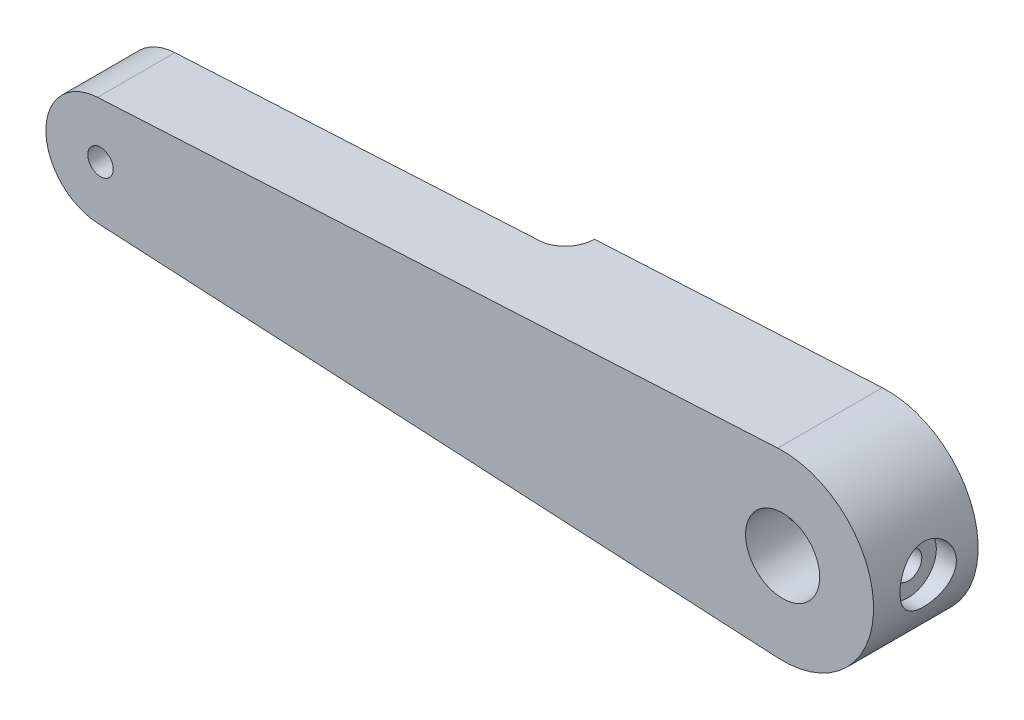
ISO-10303-21;
HEADER;
FILE_DESCRIPTION(('STEP AP214'),'2;1');
FILE_NAME('part.step','',(''),(''),'','','');
FILE_SCHEMA(('AUTOMOTIVE_DESIGN { 1 0 10303 214 1 1 1 1 }'));
ENDSEC;
DATA;
#1=APPLICATION_CONTEXT('core data for automotive mechanical design processes');
#2=APPLICATION_PROTOCOL_DEFINITION('international standard','automotive_design',2000,#1);
#3=PRODUCT_CONTEXT('',#1,'mechanical');
#4=PRODUCT('Part','Part','',(#3));
#5=PRODUCT_RELATED_PRODUCT_CATEGORY('part','',(#4));
#6=PRODUCT_DEFINITION_FORMATION('','',#4);
#7=PRODUCT_DEFINITION_CONTEXT('part definition',#1,'design');
#8=PRODUCT_DEFINITION('design','',#6,#7);
#9=PRODUCT_DEFINITION_SHAPE('','',#8);
#10=(LENGTH_UNIT() NAMED_UNIT(*) SI_UNIT(.MILLI.,.METRE.));
#11=(NAMED_UNIT(*) PLANE_ANGLE_UNIT() SI_UNIT($,.RADIAN.));
#12=(NAMED_UNIT(*) SI_UNIT($,.STERADIAN.) SOLID_ANGLE_UNIT());
#13=UNCERTAINTY_MEASURE_WITH_UNIT(LENGTH_MEASURE(1.E-05),#10,'distance_accuracy_value','');
#14=(GEOMETRIC_REPRESENTATION_CONTEXT(3) GLOBAL_UNCERTAINTY_ASSIGNED_CONTEXT((#13)) GLOBAL_UNIT_ASSIGNED_CONTEXT((#10,
#11,#12)) REPRESENTATION_CONTEXT('',''));
#15=CARTESIAN_POINT('',(0.,0.,0.));
#16=DIRECTION('',(0.,0.,1.));
#17=DIRECTION('',(1.,0.,0.));
#18=AXIS2_PLACEMENT_3D('',#15,#16,#17);
#19=CARTESIAN_POINT('',(-42.8022278368324,1.75605774082383E-09,-105.671884172269));
#20=DIRECTION('',(0.,0.,1.));
#21=DIRECTION('',(1.,0.,0.));
#22=AXIS2_PLACEMENT_3D('',#19,#20,#21);
#23=CYLINDRICAL_SURFACE('',#22,1.40000000752389);
#24=CARTESIAN_POINT('',(-42.8022278368324,1.75605774082383E-09,0.));
#25=DIRECTION('',(0.,0.,1.));
#26=DIRECTION('',(1.,0.,0.));
#27=AXIS2_PLACEMENT_3D('',#24,#25,#26);
#28=CIRCLE('',#27,1.40000000752389);
#29=CARTESIAN_POINT('',(-41.4022278293085,1.75605774082383E-09,0.));
#30=VERTEX_POINT('',#29);
#31=EDGE_CURVE('E123',#30,#30,#28,.T.);
#32=CARTESIAN_POINT('',(-42.8022278368324,1.75605774082383E-09,-6.00000000002038));
#33=DIRECTION('',(0.,0.,-1.));
#34=DIRECTION('',(-1.,0.,0.));
#35=AXIS2_PLACEMENT_3D('',#32,#33,#34);
#36=CIRCLE('',#35,1.40000000752389);
#37=CARTESIAN_POINT('',(-41.4022278293085,1.75605774082383E-09,-6.00000000002036));
#38=VERTEX_POINT('',#37);
#39=EDGE_CURVE('E44',#38,#38,#36,.F.);
#40=CARTESIAN_POINT('',(-41.4022278293085,1.75605774082383E-09,0.));
#41=CARTESIAN_POINT('',(-41.4022278293085,1.75605774082383E-09,-0.0625000000002245));
#42=CARTESIAN_POINT('',(-41.4022278293085,1.75605774082383E-09,-0.125000000000435));
#43=CARTESIAN_POINT('',(-41.4022278293085,1.75605774082383E-09,-0.250000000000861));
#44=CARTESIAN_POINT('',(-41.4022278293085,1.75605774082383E-09,-0.312500000001076));
#45=CARTESIAN_POINT('',(-41.4022278293085,1.75605774082383E-09,-0.437500000001502));
#46=CARTESIAN_POINT('',(-41.4022278293085,1.75605774082383E-09,-0.500000000001712));
#47=CARTESIAN_POINT('',(-41.4022278293085,1.75605774082383E-09,-0.625000000002133));
#48=CARTESIAN_POINT('',(-41.4022278293085,1.75605774082383E-09,-0.687500000002344));
#49=CARTESIAN_POINT('',(-41.4022278293085,1.75605774082383E-09,-0.812500000002769));
#50=CARTESIAN_POINT('',(-41.4022278293085,1.75605774082383E-09,-0.875000000002985));
#51=CARTESIAN_POINT('',(-41.4022278293085,1.75605774082383E-09,-1.00000000000341));
#52=CARTESIAN_POINT('',(-41.4022278293085,1.75605774082383E-09,-1.06250000000362));
#53=CARTESIAN_POINT('',(-41.4022278293085,1.75605774082383E-09,-1.18750000000404));
#54=CARTESIAN_POINT('',(-41.4022278293085,1.75605774082383E-09,-1.25000000000425));
#55=CARTESIAN_POINT('',(-41.4022278293085,1.75605774082383E-09,-1.37500000000467));
#56=CARTESIAN_POINT('',(-41.4022278293085,1.75605774082383E-09,-1.43750000000488));
#57=CARTESIAN_POINT('',(-41.4022278293085,1.75605774082383E-09,-1.56250000000531));
#58=CARTESIAN_POINT('',(-41.4022278293085,1.75605774082383E-09,-1.62500000000552));
#59=CARTESIAN_POINT('',(-41.4022278293085,1.75605774082383E-09,-1.75000000000595));
#60=CARTESIAN_POINT('',(-41.4022278293085,1.75605774082383E-09,-1.81250000000616));
#61=CARTESIAN_POINT('',(-41.4022278293085,1.75605774082383E-09,-1.93750000000658));
#62=CARTESIAN_POINT('',(-41.4022278293085,1.75605774082383E-09,-2.00000000000679));
#63=CARTESIAN_POINT('',(-41.4022278293085,1.75605774082383E-09,-2.12500000000722));
#64=CARTESIAN_POINT('',(-41.4022278293085,1.75605774082383E-09,-2.18750000000743));
#65=CARTESIAN_POINT('',(-41.4022278293085,1.75605774082383E-09,-2.31250000000786));
#66=CARTESIAN_POINT('',(-41.4022278293085,1.75605774082383E-09,-2.37500000000807));
#67=CARTESIAN_POINT('',(-41.4022278293085,1.75605774082383E-09,-2.50000000000849));
#68=CARTESIAN_POINT('',(-41.4022278293085,1.75605774082383E-09,-2.5625000000087));
#69=CARTESIAN_POINT('',(-41.4022278293085,1.75605774082383E-09,-2.68750000000913));
#70=CARTESIAN_POINT('',(-41.4022278293085,1.75605774082383E-09,-2.75000000000934));
#71=CARTESIAN_POINT('',(-41.4022278293085,1.75605774082383E-09,-2.87500000000977));
#72=CARTESIAN_POINT('',(-41.4022278293085,1.75605774082383E-09,-2.93750000000998));
#73=CARTESIAN_POINT('',(-41.4022278293085,1.75605774082383E-09,-3.0625000000104));
#74=CARTESIAN_POINT('',(-41.4022278293085,1.75605774082383E-09,-3.12500000001061));
#75=CARTESIAN_POINT('',(-41.4022278293085,1.75605774082383E-09,-3.25000000001104));
#76=CARTESIAN_POINT('',(-41.4022278293085,1.75605774082383E-09,-3.31250000001125));
#77=CARTESIAN_POINT('',(-41.4022278293085,1.75605774082383E-09,-3.43750000001168));
#78=CARTESIAN_POINT('',(-41.4022278293085,1.75605774082383E-09,-3.50000000001189));
#79=CARTESIAN_POINT('',(-41.4022278293085,1.75605774082383E-09,-3.62500000001231));
#80=CARTESIAN_POINT('',(-41.4022278293085,1.75605774082383E-09,-3.68750000001252));
#81=CARTESIAN_POINT('',(-41.4022278293085,1.75605774082383E-09,-3.81250000001294));
#82=CARTESIAN_POINT('',(-41.4022278293085,1.75605774082383E-09,-3.87500000001316));
#83=CARTESIAN_POINT('',(-41.4022278293085,1.75605774082383E-09,-4.00000000001359));
#84=CARTESIAN_POINT('',(-41.4022278293085,1.75605774082383E-09,-4.0625000000138));
#85=CARTESIAN_POINT('',(-41.4022278293085,1.75605774082383E-09,-4.18750000001422));
#86=CARTESIAN_POINT('',(-41.4022278293085,1.75605774082383E-09,-4.25000000001443));
#87=CARTESIAN_POINT('',(-41.4022278293085,1.75605774082383E-09,-4.37500000001485));
#88=CARTESIAN_POINT('',(-41.4022278293085,1.75605774082383E-09,-4.43750000001507));
#89=CARTESIAN_POINT('',(-41.4022278293085,1.75605774082383E-09,-4.56250000001549));
#90=CARTESIAN_POINT('',(-41.4022278293085,1.75605774082383E-09,-4.6250000000157));
#91=CARTESIAN_POINT('',(-41.4022278293085,1.75605774082383E-09,-4.75000000001613));
#92=CARTESIAN_POINT('',(-41.4022278293085,1.75605774082383E-09,-4.81250000001634));
#93=CARTESIAN_POINT('',(-41.4022278293085,1.75605774082383E-09,-4.93750000001676));
#94=CARTESIAN_POINT('',(-41.4022278293085,1.75605774082383E-09,-5.00000000001697));
#95=CARTESIAN_POINT('',(-41.4022278293085,1.75605774082383E-09,-5.12500000001739));
#96=CARTESIAN_POINT('',(-41.4022278293085,1.75605774082383E-09,-5.18750000001761));
#97=CARTESIAN_POINT('',(-41.4022278293085,1.75605774082383E-09,-5.31250000001803));
#98=CARTESIAN_POINT('',(-41.4022278293085,1.75605774082383E-09,-5.37500000001824));
#99=CARTESIAN_POINT('',(-41.4022278293085,1.75605774082383E-09,-5.50000000001867));
#100=CARTESIAN_POINT('',(-41.4022278293085,1.75605774082383E-09,-5.56250000001888));
#101=CARTESIAN_POINT('',(-41.4022278293085,1.75605774082383E-09,-5.6875000000193));
#102=CARTESIAN_POINT('',(-41.4022278293085,1.75605774082383E-09,-5.75000000001952));
#103=CARTESIAN_POINT('',(-41.4022278293085,1.75605774082383E-09,-5.87500000001994));
#104=CARTESIAN_POINT('',(-41.4022278293085,1.75605774082383E-09,-5.93750000002015));
#105=CARTESIAN_POINT('',(-41.4022278293085,1.75605774082383E-09,-6.00000000002036));
#106=B_SPLINE_CURVE_WITH_KNOTS('',3,(#40,#41,#42,#43,#44,#45,#46,#47,#48,#49,#50,#51,#52,#53,
#54,#55,#56,#57,#58,#59,#60,#61,#62,#63,#64,#65,#66,#67,#68,#69,#70,#71,#72,#73,#74,#75,#76,#77,
#78,#79,#80,#81,#82,#83,#84,#85,#86,#87,#88,#89,#90,#91,#92,#93,#94,#95,#96,#97,#98,#99,#100,
#101,#102,#103,#104,#105),.UNSPECIFIED.,.F.,.F.,(4,2,2,2,2,2,2,2,2,2,2,2,2,2,2,2,2,2,2,2,2,2,2,
2,2,2,2,2,2,2,2,2,4),(0.,0.187500000000632,0.375000000001277,0.562500000001909,0.75000000000254,
0.937500000003186,1.12500000000382,1.31250000000445,1.50000000000508,1.68750000000573,
1.87500000000636,2.06250000000699,2.25000000000763,2.43750000000827,2.6250000000089,
2.81250000000954,3.00000000001017,3.18750000001081,3.37500000001145,3.56250000001208,
3.75000000001272,3.93750000001336,4.12500000001399,4.31250000001462,4.50000000001527,
4.6875000000159,4.87500000001653,5.06250000001716,5.25000000001781,5.43750000001844,
5.62500000001907,5.81250000001972,6.00000000002035),.UNSPECIFIED.);
#107=EDGE_CURVE('BSEAM40',#30,#38,#106,.T.);
#108=ORIENTED_EDGE('',*,*,#31,.T.);
#109=ORIENTED_EDGE('',*,*,#39,.F.);
#110=ORIENTED_EDGE('',*,*,#107,.T.);
#111=ORIENTED_EDGE('',*,*,#107,.F.);
#112=EDGE_LOOP('',(#108,#110,#109,#111));
#113=FACE_BOUND('',#112,.T.);
#114=ADVANCED_FACE('F40',(#113),#23,.F.);
#115=CARTESIAN_POINT('',(32.1977721629763,1.71312963814785E-09,-105.671884172269));
#116=DIRECTION('',(0.,0.,1.));
#117=DIRECTION('',(1.,0.,0.));
#118=AXIS2_PLACEMENT_3D('',#115,#116,#117);
#119=CYLINDRICAL_SURFACE('',#118,10.);
#120=DIRECTION('',(0.,0.,1.));
#121=VECTOR('',#120,1.);
#122=CARTESIAN_POINT('',(31.6644388296359,-9.98576764807464,-105.671884172269));
#123=LINE('',#122,#121);
#124=CARTESIAN_POINT('',(31.6644388296359,-9.98576764807464,-11.5000000013178));
#125=VERTEX_POINT('',#124);
#126=CARTESIAN_POINT('',(31.6644388296359,-9.98576764807464,0.));
#127=VERTEX_POINT('',#126);
#128=EDGE_CURVE('E118',#125,#127,#123,.T.);
#129=ORIENTED_EDGE('',*,*,#128,.F.);
#130=CARTESIAN_POINT('',(32.1977721629763,1.71312963814785E-09,-11.5000000013188));
#131=DIRECTION('',(0.,0.,-1.));
#132=DIRECTION('',(-1.,0.,0.));
#133=AXIS2_PLACEMENT_3D('',#130,#131,#132);
#134=CIRCLE('',#133,10.);
#135=CARTESIAN_POINT('',(31.6644388296473,9.98576765150151,-11.5000000013189));
#136=VERTEX_POINT('',#135);
#137=EDGE_CURVE('E115',#125,#136,#134,.F.);
#138=ORIENTED_EDGE('',*,*,#137,.T.);
#139=DIRECTION('',(0.,0.,1.));
#140=VECTOR('',#139,1.);
#141=CARTESIAN_POINT('',(31.6644388296473,9.98576765150151,-105.671884172269));
#142=LINE('',#141,#140);
#143=CARTESIAN_POINT('',(31.6644388296473,9.98576765150151,0.));
#144=VERTEX_POINT('',#143);
#145=EDGE_CURVE('E119',#136,#144,#142,.T.);
#146=ORIENTED_EDGE('',*,*,#145,.T.);
#147=CARTESIAN_POINT('',(32.1977721629763,1.71312963814785E-09,0.));
#148=DIRECTION('',(0.,0.,1.));
#149=DIRECTION('',(1.,0.,0.));
#150=AXIS2_PLACEMENT_3D('',#147,#148,#149);
#151=CIRCLE('',#150,10.);
#152=EDGE_CURVE('E239',#127,#144,#151,.T.);
#153=ORIENTED_EDGE('',*,*,#152,.F.);
#154=EDGE_LOOP('',(#129,#138,#146,#153));
#155=FACE_BOUND('',#154,.T.);
#156=CARTESIAN_POINT('',(42.1977721629763,5.50706756981693E-09,-2.90000000503516));
#157=CARTESIAN_POINT('',(42.1977711836474,0.169796926120065,-2.9000013135646));
#158=CARTESIAN_POINT('',(42.1934065866101,0.339607341704801,-2.91399651371412));
#159=CARTESIAN_POINT('',(42.1764227069265,0.674266446092099,-2.96946362726612));
#160=CARTESIAN_POINT('',(42.1638014361587,0.839113929869421,-3.01094215840123));
#161=CARTESIAN_POINT('',(42.1316838367033,1.15897273310765,-3.11984582876195));
#162=CARTESIAN_POINT('',(42.1121980529934,1.31399871141106,-3.18723118542552));
#163=CARTESIAN_POINT('',(42.0683660676278,1.6105511268055,-3.34586766417737));
#164=CARTESIAN_POINT('',(42.0440191239252,1.75207549802115,-3.43712243054691));
#165=CARTESIAN_POINT('',(41.9922226970948,2.02191666004311,-3.6438325125257));
#166=CARTESIAN_POINT('',(41.9647064253219,2.14976462692366,-3.75988304025361));
#167=CARTESIAN_POINT('',(41.9100617767673,2.38453104346079,-4.01162281260064));
#168=CARTESIAN_POINT('',(41.8829334715912,2.49144567458281,-4.14731563241252));
#169=CARTESIAN_POINT('',(41.8314217083579,2.68383734735244,-4.43852816684349));
#170=CARTESIAN_POINT('',(41.8071207982747,2.76873144325103,-4.59444899312804));
#171=CARTESIAN_POINT('',(41.7650185166868,2.91089923973727,-4.91922936275848));
#172=CARTESIAN_POINT('',(41.747215464306,2.96818008459648,-5.08808554627177));
#173=CARTESIAN_POINT('',(41.7208227087741,3.0517849548395,-5.42865823504122));
#174=CARTESIAN_POINT('',(41.7119751607382,3.07897757463332,-5.6001409809672));
#175=CARTESIAN_POINT('',(41.7037293053608,3.10434744326926,-5.94544538989584));
#176=CARTESIAN_POINT('',(41.7043285317054,3.10253226531166,-6.11926643058868));
#177=CARTESIAN_POINT('',(41.7146807348727,3.07061800761989,-6.45715316126252));
#178=CARTESIAN_POINT('',(41.7240774009167,3.0416198271766,-6.6213355829157));
#179=CARTESIAN_POINT('',(41.7503873661346,2.95794639923727,-6.9423795792914));
#180=CARTESIAN_POINT('',(41.7673014525428,2.90326846248875,-7.09924038538296));
#181=CARTESIAN_POINT('',(41.8070158239261,2.76900342494922,-7.40382524138043));
#182=CARTESIAN_POINT('',(41.8298975084348,2.68906834101547,-7.55138482702286));
#183=CARTESIAN_POINT('',(41.8789312218743,2.50679978137822,-7.83135880168759));
#184=CARTESIAN_POINT('',(41.9050840881779,2.40446056550588,-7.96376929609496));
#185=CARTESIAN_POINT('',(41.9591459913917,2.17487334715262,-8.21591441857976));
#186=CARTESIAN_POINT('',(41.9870812413,2.04671553937202,-8.3348165202221));
#187=CARTESIAN_POINT('',(42.040527007561,1.77193162301202,-8.54964187504817));
#188=CARTESIAN_POINT('',(42.0660373498713,1.62530419057027,-8.64556347960842));
#189=CARTESIAN_POINT('',(42.1120195759006,1.31615737396703,-8.81225709074406));
#190=CARTESIAN_POINT('',(42.1324518830902,1.15352615691897,-8.88283334788918));
#191=CARTESIAN_POINT('',(42.1656902964505,0.817919690128393,-8.99538076961163));
#192=CARTESIAN_POINT('',(42.1784986797372,0.644947546019809,-9.03736047595673));
#193=CARTESIAN_POINT('',(42.1946809381736,0.300638153136346,-9.09011150322998));
#194=CARTESIAN_POINT('',(42.1983954315167,0.12948937033705,-9.1020101181961));
#195=CARTESIAN_POINT('',(42.1969771380553,-0.212376213714388,-9.09743579691586));
#196=CARTESIAN_POINT('',(42.191845620874,-0.383093073436519,-9.08096693211068));
#197=CARTESIAN_POINT('',(42.1735355456559,-0.714919588619507,-9.021031486797));
#198=CARTESIAN_POINT('',(42.1605563238421,-0.876162011608632,-8.9782332320579));
#199=CARTESIAN_POINT('',(42.1280659562289,-1.18913445772366,-8.8676670692695));
#200=CARTESIAN_POINT('',(42.108554007714,-1.34086330913833,-8.79989609256891));
#201=CARTESIAN_POINT('',(42.0644215974235,-1.63457370996547,-8.63947799454446));
#202=CARTESIAN_POINT('',(42.039689205492,-1.77623161882144,-8.54626995427989));
#203=CARTESIAN_POINT('',(41.9879463710008,-2.04227504254073,-8.33829826436243));
#204=CARTESIAN_POINT('',(41.9609353210494,-2.16665592856373,-8.22352885731346));
#205=CARTESIAN_POINT('',(41.9063563516618,-2.3996421076068,-7.97039109886652));
#206=CARTESIAN_POINT('',(41.8788077235161,-2.50744419622582,-7.83127765877398));
#207=CARTESIAN_POINT('',(41.8273767953632,-2.69824262755288,-7.53633640151634));
#208=CARTESIAN_POINT('',(41.8034944286966,-2.78123942129145,-7.38050888833046));
#209=CARTESIAN_POINT('',(41.7623673766701,-2.9195436402121,-7.05692272197694));
#210=CARTESIAN_POINT('',(41.7450958942454,-2.97496312968798,-6.88921557320666));
#211=CARTESIAN_POINT('',(41.7192826135946,-3.05658417388407,-6.54620662606283));
#212=CARTESIAN_POINT('',(41.7107375617606,-3.0827966186431,-6.37090768368353));
#213=CARTESIAN_POINT('',(41.703679953569,-3.10448579701719,-6.026077085717));
#214=CARTESIAN_POINT('',(41.7047378394771,-3.10127846374769,-5.85663595662774));
#215=CARTESIAN_POINT('',(41.7157255754597,-3.06738862209708,-5.5208320146468));
#216=CARTESIAN_POINT('',(41.7256550239316,-3.03670735742008,-5.35446906275854));
#217=CARTESIAN_POINT('',(41.7529693266748,-2.9496152223133,-5.03185593758467));
#218=CARTESIAN_POINT('',(41.7702465165943,-2.89357519549679,-4.87549585085574));
#219=CARTESIAN_POINT('',(41.8102836333451,-2.75764758414724,-4.57427261983844));
#220=CARTESIAN_POINT('',(41.8330446623654,-2.67775520479045,-4.42941179456177));
#221=CARTESIAN_POINT('',(41.8825805714036,-2.49278488508136,-4.14924997783269));
#222=CARTESIAN_POINT('',(41.9094764308283,-2.38685417427608,-4.01453344485811));
#223=CARTESIAN_POINT('',(41.9636889440132,-2.15432169031316,-3.76436225076022));
#224=CARTESIAN_POINT('',(41.9910057078691,-2.02771442272968,-3.64891272603289));
#225=CARTESIAN_POINT('',(42.0440289442204,-1.75255503438902,-3.43686384844485));
#226=CARTESIAN_POINT('',(42.0696560911487,-1.6034310507027,-3.3409845451608));
#227=CARTESIAN_POINT('',(42.1154263163477,-1.29038693955394,-3.17578490405383));
#228=CARTESIAN_POINT('',(42.1355716337833,-1.12647288993708,-3.10645371738577));
#229=CARTESIAN_POINT('',(42.1666316638049,-0.803593095403844,-3.00159465963986));
#230=CARTESIAN_POINT('',(42.178208957159,-0.645488013147488,-2.96360507795451));
#231=CARTESIAN_POINT('',(42.1937789364856,-0.324925501088164,-2.9128095776879));
#232=CARTESIAN_POINT('',(42.1977731000399,-0.16246892543643,-2.89999875297842));
#233=CARTESIAN_POINT('',(42.1977721629763,5.50706756981693E-09,-2.90000000503516));
#234=B_SPLINE_CURVE_WITH_KNOTS('',3,(#156,#157,#158,#159,#160,#161,#162,#163,#164,#165,#166,
#167,#168,#169,#170,#171,#172,#173,#174,#175,#176,#177,#178,#179,#180,#181,#182,#183,#184,#185,
#186,#187,#188,#189,#190,#191,#192,#193,#194,#195,#196,#197,#198,#199,#200,#201,#202,#203,#204,
#205,#206,#207,#208,#209,#210,#211,#212,#213,#214,#215,#216,#217,#218,#219,#220,#221,#222,#223,
#224,#225,#226,#227,#228,#229,#230,#231,#232,#233),.UNSPECIFIED.,.T.,.F.,(4,2,2,2,2,2,2,2,2,2,2,
2,2,2,2,2,2,2,2,2,2,2,2,2,2,2,2,2,2,2,2,2,2,2,2,2,2,2,4),(0.,0.508793659659005,1.01770987668265,
1.52584770261798,2.03406315423222,2.55622032157495,3.07847264916322,3.61339374877468,
4.1481763759044,4.66708170893504,5.18585157115756,5.68447945177002,6.18315956166978,
6.68903411257609,7.19503842574539,7.72368893079506,8.2523773499431,8.78506536062965,
9.31759418796463,9.82984901475008,10.3420303263119,10.8417185295058,11.3414681549376,
11.8532794611183,12.3652276278026,12.8971171104203,13.428996921192,13.9586973429913,
14.4882001963442,14.9941382867676,15.5000534752823,15.9987980454851,16.4976429414021,
17.0157339195469,17.533962795806,18.0687478086477,18.6033140486347,19.0902443973546,
19.5770798573688),.UNSPECIFIED.);
#235=CARTESIAN_POINT('',(42.1977721629763,5.50706756981693E-09,-2.90000000503516));
#236=VERTEX_POINT('',#235);
#237=EDGE_CURVE('E50',#236,#236,#234,.T.);
#238=ORIENTED_EDGE('',*,*,#237,.T.);
#239=EDGE_LOOP('',(#238));
#240=FACE_BOUND('',#239,.T.);
#241=ADVANCED_FACE('F163',(#155,#240),#119,.T.);
#242=CARTESIAN_POINT('',(42.1977721629763,5.50706756981693E-09,-6.0000000001478));
#243=DIRECTION('',(-1.,0.,0.));
#244=DIRECTION('',(0.,0.,1.));
#245=AXIS2_PLACEMENT_3D('',#242,#243,#244);
#246=CYLINDRICAL_SURFACE('',#245,1.49999999511264);
#247=CARTESIAN_POINT('',(36.2727721625505,1.75606692567482E-09,-7.49999999526045));
#248=CARTESIAN_POINT('',(36.2727739431891,-0.0813402403111863,-7.50000240565832));
#249=CARTESIAN_POINT('',(36.2703153192706,-0.162663680527083,-7.49336291173075));
#250=CARTESIAN_POINT('',(36.2607524379091,-0.322885990720881,-7.46708324544058));
#251=CARTESIAN_POINT('',(36.2536486604193,-0.401785110306204,-7.44744441621128));
#252=CARTESIAN_POINT('',(36.235559635444,-0.55482531875174,-7.39595081089512));
#253=CARTESIAN_POINT('',(36.2245817093928,-0.628975072893411,-7.36411906756838));
#254=CARTESIAN_POINT('',(36.1998424016804,-0.770878268226483,-7.28925812716103));
#255=CARTESIAN_POINT('',(36.1860803034245,-0.838630056100738,-7.24622604650093));
#256=CARTESIAN_POINT('',(36.1565652996347,-0.968601919592869,-7.14833472440096));
#257=CARTESIAN_POINT('',(36.1407574843948,-1.03052359016324,-7.09309598700121));
#258=CARTESIAN_POINT('',(36.1092082055579,-1.14446261935879,-6.97316510120197));
#259=CARTESIAN_POINT('',(36.0934667624996,-1.19647710485232,-6.90847022005948));
#260=CARTESIAN_POINT('',(36.0631998059626,-1.29098849076853,-6.76858782047778));
#261=CARTESIAN_POINT('',(36.048739463243,-1.33306972903977,-6.69310395566971));
#262=CARTESIAN_POINT('',(36.023522995841,-1.40380781144324,-6.5355136478325));
#263=CARTESIAN_POINT('',(36.0127654534024,-1.43246979515871,-6.45340975442513));
#264=CARTESIAN_POINT('',(35.9967581101903,-1.47438770560968,-6.28833913326397));
#265=CARTESIAN_POINT('',(35.9913061000359,-1.48821150917663,-6.20553686840668));
#266=CARTESIAN_POINT('',(35.9859341940348,-1.50183635121797,-6.03862224553878));
#267=CARTESIAN_POINT('',(35.9860121191647,-1.50164291306505,-5.95451041661266));
#268=CARTESIAN_POINT('',(35.9915164304292,-1.48767413081585,-5.79249588224921));
#269=CARTESIAN_POINT('',(35.996635946423,-1.47467803952697,-5.7145136520476));
#270=CARTESIAN_POINT('',(36.0111379679093,-1.43675814803382,-5.56192625837844));
#271=CARTESIAN_POINT('',(36.0205210916652,-1.4118326179201,-5.48732158641471));
#272=CARTESIAN_POINT('',(36.042683540065,-1.35031971705025,-5.34198779034946));
#273=CARTESIAN_POINT('',(36.0555224129673,-1.31352537985746,-5.27135574485149));
#274=CARTESIAN_POINT('',(36.0831290319577,-1.22946343442378,-5.13703884619754));
#275=CARTESIAN_POINT('',(36.0978974258898,-1.1821923048324,-5.07335633961384));
#276=CARTESIAN_POINT('',(36.128862759206,-1.07492300637281,-4.95042096348071));
#277=CARTESIAN_POINT('',(36.1450903670593,-1.0143001522696,-4.89171960149005));
#278=CARTESIAN_POINT('',(36.1763234699774,-0.883881204836265,-4.78515590037097));
#279=CARTESIAN_POINT('',(36.1913287904734,-0.814083804893144,-4.73729510777478));
#280=CARTESIAN_POINT('',(36.2187058531034,-0.665931684299651,-4.65319240331387));
#281=CARTESIAN_POINT('',(36.2310365180521,-0.587468121416281,-4.6171279064542));
#282=CARTESIAN_POINT('',(36.2513715425144,-0.425021350425523,-4.55889174776644));
#283=CARTESIAN_POINT('',(36.2593777503693,-0.341040517729252,-4.5367141498114));
#284=CARTESIAN_POINT('',(36.2698400906397,-0.174589470415358,-4.50792708825009));
#285=CARTESIAN_POINT('',(36.2725608683065,-0.0922642739389796,-4.50057454336648));
#286=CARTESIAN_POINT('',(36.2729594402915,0.0724786641317013,-4.49949071230917));
#287=CARTESIAN_POINT('',(36.2706383045979,0.154896382381185,-4.50575653606353));
#288=CARTESIAN_POINT('',(36.2613886135116,0.314314939390234,-4.531162386378));
#289=CARTESIAN_POINT('',(36.2546324666855,0.391403544747432,-4.54982096019968));
#290=CARTESIAN_POINT('',(36.237364956706,0.541306075392459,-4.59885430813425));
#291=CARTESIAN_POINT('',(36.2268531049305,0.614119443030628,-4.62923060677884));
#292=CARTESIAN_POINT('',(36.2027388061978,0.755765163300645,-4.70179554993715));
#293=CARTESIAN_POINT('',(36.1890556777986,0.824421178649665,-4.74430077924361));
#294=CARTESIAN_POINT('',(36.1601194799808,0.953852308429226,-4.83955696758278));
#295=CARTESIAN_POINT('',(36.144865847294,1.01462457753543,-4.89231160867064));
#296=CARTESIAN_POINT('',(36.1134146544191,1.13011101065896,-5.01003991727245));
#297=CARTESIAN_POINT('',(36.097211962399,1.18429714820259,-5.07553152258166));
#298=CARTESIAN_POINT('',(36.0665220780837,1.2810078153942,-5.21500323032151));
#299=CARTESIAN_POINT('',(36.0520350107083,1.32353149615997,-5.28898395009878));
#300=CARTESIAN_POINT('',(36.0264947756811,1.39570267535011,-5.44382799837986));
#301=CARTESIAN_POINT('',(36.0154515996235,1.42531280554934,-5.52471050176288));
#302=CARTESIAN_POINT('',(35.9983520901924,1.47030876111869,-5.69083060296192));
#303=CARTESIAN_POINT('',(35.9922928242498,1.48570295190669,-5.77606560832816));
#304=CARTESIAN_POINT('',(35.9862274183529,1.50109748234238,-5.94277337567415));
#305=CARTESIAN_POINT('',(35.9858689148573,1.50199398508257,-6.02415128876261));
#306=CARTESIAN_POINT('',(35.9903477543326,1.49064813039176,-6.18583246384463));
#307=CARTESIAN_POINT('',(35.9951846408558,1.47840692719059,-6.26613581961727));
#308=CARTESIAN_POINT('',(36.0092209842245,1.44182089597687,-6.42108642096664));
#309=CARTESIAN_POINT('',(36.0182929999154,1.41782869862447,-6.49582944580738));
#310=CARTESIAN_POINT('',(36.0397075563808,1.35872753595283,-6.64027595478904));
#311=CARTESIAN_POINT('',(36.0520509090229,1.32361581061079,-6.70997818245139));
#312=CARTESIAN_POINT('',(36.0794010385755,1.24119166026029,-6.84622821208596));
#313=CARTESIAN_POINT('',(36.0945115622321,1.19334821979115,-6.91243371735394));
#314=CARTESIAN_POINT('',(36.125323865254,1.08765348086672,-7.03616353111246));
#315=CARTESIAN_POINT('',(36.141025827801,1.02979906151316,-7.09368512191158));
#316=CARTESIAN_POINT('',(36.172220631119,0.902169596226573,-7.20142144774962));
#317=CARTESIAN_POINT('',(36.1876613002975,0.83193487984535,-7.25110908463895));
#318=CARTESIAN_POINT('',(36.2157375530823,0.683573570822425,-7.33795138437781));
#319=CARTESIAN_POINT('',(36.2283730904609,0.605446848153495,-7.37510584068922));
#320=CARTESIAN_POINT('',(36.2496899220649,0.441164936793596,-7.43640785409484));
#321=CARTESIAN_POINT('',(36.2582508883296,0.354846435599519,-7.460163050495));
#322=CARTESIAN_POINT('',(36.269789757554,0.179010859742007,-7.49195421525413));
#323=CARTESIAN_POINT('',(36.2727702033885,0.0894952608584403,-7.4999973432007));
#324=CARTESIAN_POINT('',(36.2727721625505,1.75606692567482E-09,-7.49999999526045));
#325=B_SPLINE_CURVE_WITH_KNOTS('',3,(#247,#248,#249,#250,#251,#252,#253,#254,#255,#256,#257,
#258,#259,#260,#261,#262,#263,#264,#265,#266,#267,#268,#269,#270,#271,#272,#273,#274,#275,#276,
#277,#278,#279,#280,#281,#282,#283,#284,#285,#286,#287,#288,#289,#290,#291,#292,#293,#294,#295,
#296,#297,#298,#299,#300,#301,#302,#303,#304,#305,#306,#307,#308,#309,#310,#311,#312,#313,#314,
#315,#316,#317,#318,#319,#320,#321,#322,#323,#324),.UNSPECIFIED.,.T.,.F.,(4,2,2,2,2,2,2,2,2,2,2,
2,2,2,2,2,2,2,2,2,2,2,2,2,2,2,2,2,2,2,2,2,2,2,2,2,2,2,4),(0.,0.243690747904358,
0.487356320822874,0.73056385463724,0.973834065416847,1.22612785649789,1.47849470296851,
1.74005348655097,2.00151201083348,2.25256214520253,2.5035133559788,2.74007815437313,
2.97667726785437,3.21764802693012,3.45869990175021,3.71531602715559,3.97196873878459,
4.23232077817983,4.49256145076043,4.7393969292778,4.98618002981534,5.22389637946997,
5.4616436675889,5.70627553301273,5.95099544438221,6.20938523105562,6.46779382031259,
6.72694528928316,6.98594416233327,7.22886744176691,7.47176938061457,7.70779160983553,
7.94387246906163,8.19199633845933,8.44019769968814,8.70114827415589,8.96210314869821,
9.23034812562705,9.49847084164405),.UNSPECIFIED.);
#326=CARTESIAN_POINT('',(36.2727721625505,1.75606692567482E-09,-7.49999999526045));
#327=VERTEX_POINT('',#326);
#328=EDGE_CURVE('E141',#327,#327,#325,.T.);
#329=ORIENTED_EDGE('',*,*,#328,.T.);
#330=EDGE_LOOP('',(#329));
#331=FACE_BOUND('',#330,.T.);
#332=CARTESIAN_POINT('',(40.,5.50706756981693E-09,-6.0000000001478));
#333=DIRECTION('',(1.,0.,0.));
#334=DIRECTION('',(0.,0.,-1.));
#335=AXIS2_PLACEMENT_3D('',#332,#333,#334);
#336=CIRCLE('',#335,1.49999999511264);
#337=CARTESIAN_POINT('',(40.,5.50706756981693E-09,-7.49999999526045));
#338=VERTEX_POINT('',#337);
#339=EDGE_CURVE('E187',#338,#338,#336,.T.);
#340=ORIENTED_EDGE('',*,*,#339,.T.);
#341=EDGE_LOOP('',(#340));
#342=FACE_BOUND('',#341,.T.);
#343=ADVANCED_FACE('F158',(#331,#342),#246,.F.);
#344=CARTESIAN_POINT('',(32.1977721631676,1.75606692567482E-09,-105.671884172269));
#345=DIRECTION('',(0.,0.,1.));
#346=DIRECTION('',(1.,0.,0.));
#347=AXIS2_PLACEMENT_3D('',#344,#345,#346);
#348=CYLINDRICAL_SURFACE('',#347,4.07499999938293);
#349=CARTESIAN_POINT('',(32.1977721631676,1.75606692567482E-09,0.));
#350=DIRECTION('',(0.,0.,1.));
#351=DIRECTION('',(1.,0.,0.));
#352=AXIS2_PLACEMENT_3D('',#349,#350,#351);
#353=CIRCLE('',#352,4.07499999938293);
#354=CARTESIAN_POINT('',(36.2727721625505,1.75606692567482E-09,0.));
#355=VERTEX_POINT('',#354);
#356=EDGE_CURVE('E246',#355,#355,#353,.T.);
#357=ORIENTED_EDGE('',*,*,#356,.T.);
#358=EDGE_LOOP('',(#357));
#359=FACE_BOUND('',#358,.T.);
#360=CARTESIAN_POINT('',(32.1977721631676,1.75606692567482E-09,-11.5000000013188));
#361=DIRECTION('',(0.,0.,-1.));
#362=DIRECTION('',(-1.,0.,0.));
#363=AXIS2_PLACEMENT_3D('',#360,#361,#362);
#364=CIRCLE('',#363,4.07499999938293);
#365=CARTESIAN_POINT('',(28.1227721637847,1.75606692567482E-09,-11.5000000013187));
#366=VERTEX_POINT('',#365);
#367=EDGE_CURVE('E129',#366,#366,#364,.F.);
#368=ORIENTED_EDGE('',*,*,#367,.F.);
#369=EDGE_LOOP('',(#368));
#370=FACE_BOUND('',#369,.T.);
#371=CARTESIAN_POINT('',(28.1227721637847,5.50706756981693E-09,-4.50000000503516));
#372=CARTESIAN_POINT('',(28.1227703830712,-0.0813402365328151,-4.49999759443386));
#373=CARTESIAN_POINT('',(28.1252290069132,-0.16266367674011,-4.5066370881536));
#374=CARTESIAN_POINT('',(28.1347918881267,-0.322885986954798,-4.5329167540275));
#375=CARTESIAN_POINT('',(28.141895665545,-0.401785106569621,-4.55255558304827));
#376=CARTESIAN_POINT('',(28.1599846903901,-0.554825315110576,-4.60404918795442));
#377=CARTESIAN_POINT('',(28.1709626163826,-0.628975069318037,-4.63588093107982));
#378=CARTESIAN_POINT('',(28.1957019239962,-0.770878264813929,-4.71074187109534));
#379=CARTESIAN_POINT('',(28.2094640222119,-0.838630052785218,-4.75377395156496));
#380=CARTESIAN_POINT('',(28.2389790259406,-0.968601916493552,-4.85166527328295));
#381=CARTESIAN_POINT('',(28.2547868411602,-1.03052358718542,-4.90690401049008));
#382=CARTESIAN_POINT('',(28.2863361199844,-1.1444626166558,-5.02683489591823));
#383=CARTESIAN_POINT('',(28.3020775630504,-1.19647710230265,-5.09152977688226));
#384=CARTESIAN_POINT('',(28.3323445196413,-1.29098848858667,-5.23141217615366));
#385=CARTESIAN_POINT('',(28.3468048624074,-1.33306972706793,-5.30689604083463));
#386=CARTESIAN_POINT('',(28.3720213299305,-1.40380780991312,-5.4644863484534));
#387=CARTESIAN_POINT('',(28.3827788724437,-1.43246979386019,-5.54659024176947));
#388=CARTESIAN_POINT('',(28.3987862158264,-1.47438770479294,-5.71166086284333));
#389=CARTESIAN_POINT('',(28.4042382260732,-1.48821150860148,-5.7944631277052));
#390=CARTESIAN_POINT('',(28.4096101322588,-1.50183635111437,-5.96137775062846));
#391=CARTESIAN_POINT('',(28.4095322072211,-1.5016429131915,-6.04548957960532));
#392=CARTESIAN_POINT('',(28.4040278961238,-1.48767413137033,-6.20750411407894));
#393=CARTESIAN_POINT('',(28.3989083802076,-1.4746780402852,-6.28548634433813));
#394=CARTESIAN_POINT('',(28.3844063588598,-1.43675814918246,-6.43807373815424));
#395=CARTESIAN_POINT('',(28.3750232351647,-1.41183261925543,-6.51267841020736));
#396=CARTESIAN_POINT('',(28.3528607868736,-1.35031971876324,-6.65801220642734));
#397=CARTESIAN_POINT('',(28.340021914021,-1.31352538176897,-6.72864425199484));
#398=CARTESIAN_POINT('',(28.3124152951076,-1.22946343672405,-6.86296115081798));
#399=CARTESIAN_POINT('',(28.2976469012028,-1.18219230732293,-6.92664365750137));
#400=CARTESIAN_POINT('',(28.2666815679169,-1.0749230092431,-7.04957903387253));
#401=CARTESIAN_POINT('',(28.2504539600647,-1.01430015532831,-7.10828039600314));
#402=CARTESIAN_POINT('',(28.21922085712,-0.883881208254174,-7.21484409743513));
#403=CARTESIAN_POINT('',(28.2042155365961,-0.814083808481794,-7.26270489020424));
#404=CARTESIAN_POINT('',(28.1768384738727,-0.665931688157902,-7.34680759507476));
#405=CARTESIAN_POINT('',(28.1645078088599,-0.587468125367966,-7.38287209216336));
#406=CARTESIAN_POINT('',(28.1441727842515,-0.425021354521694,-7.44110825132179));
#407=CARTESIAN_POINT('',(28.1361665763145,-0.341040521876482,-7.46328584951852));
#408=CARTESIAN_POINT('',(28.1257042358745,-0.174589474592677,-7.49207291155875));
#409=CARTESIAN_POINT('',(28.122983458122,-0.0922642780969846,-7.49942545667561));
#410=CARTESIAN_POINT('',(28.1225848859704,0.0724786600549097,-7.50050928818564));
#411=CARTESIAN_POINT('',(28.1249060215831,0.154896378366282,-7.49424346465082));
#412=CARTESIAN_POINT('',(28.1341557125217,0.314314935495686,-7.46883761475139));
#413=CARTESIAN_POINT('',(28.1409118592783,0.391403540911098,-7.45017904113189));
#414=CARTESIAN_POINT('',(28.1581793691337,0.541306071703772,-7.40114569358694));
#415=CARTESIAN_POINT('',(28.1686912208544,0.614119439431385,-7.3707693951298));
#416=CARTESIAN_POINT('',(28.1928055194897,0.755765159874275,-7.29820445235138));
#417=CARTESIAN_POINT('',(28.2064886478453,0.824421175310519,-7.25569922324229));
#418=CARTESIAN_POINT('',(28.2354248455983,0.95385230529488,-7.16044303528701));
#419=CARTESIAN_POINT('',(28.2506784782639,1.01462457451868,-7.10768839438567));
#420=CARTESIAN_POINT('',(28.2821296711235,1.13011100792027,-6.98996008614712));
#421=CARTESIAN_POINT('',(28.298332363151,1.18429714562497,-6.92446848101283));
#422=CARTESIAN_POINT('',(28.3290222475125,1.28100781316953,-6.78499677360084));
#423=CARTESIAN_POINT('',(28.3435093149267,1.3235314941271,-6.71101605397643));
#424=CARTESIAN_POINT('',(28.3690495500706,1.39570267375598,-6.55617200591924));
#425=CARTESIAN_POINT('',(28.3800927262038,1.42531280419344,-6.47528950260265));
#426=CARTESIAN_POINT('',(28.3971922358034,1.47030876024571,-6.30916940149111));
#427=CARTESIAN_POINT('',(28.4032515018388,1.4857029512784,-6.22393439614598));
#428=CARTESIAN_POINT('',(28.4093169079199,1.50109748218623,-6.05722662877581));
#429=CARTESIAN_POINT('',(28.4096754115055,1.50199398515126,-5.97584871564473));
#430=CARTESIAN_POINT('',(28.4051965721993,1.49064813089132,-5.81416754043786));
#431=CARTESIAN_POINT('',(28.4003596857552,1.47840692789626,-5.733864184583));
#432=CARTESIAN_POINT('',(28.3863233425276,1.44182089707599,-5.57891358309323));
#433=CARTESIAN_POINT('',(28.3772513269022,1.41782869991987,-5.50417055819295));
#434=CARTESIAN_POINT('',(28.3558367705486,1.35872753762859,-5.35972404906313));
#435=CARTESIAN_POINT('',(28.343493417953,1.32361581247064,-5.29002182131215));
#436=CARTESIAN_POINT('',(28.3161432884785,1.24119166250089,-5.15377179149982));
#437=CARTESIAN_POINT('',(28.3010327648534,1.19334822223235,-5.08756628613837));
#438=CARTESIAN_POINT('',(28.2702204618685,1.08765348369979,-4.96383647216043));
#439=CARTESIAN_POINT('',(28.2545184993269,1.02979906453749,-4.90631488123535));
#440=CARTESIAN_POINT('',(28.2233236959853,0.902169599602939,-4.79857855508258));
#441=CARTESIAN_POINT('',(28.2078830267768,0.831934883377909,-4.74889091800716));
#442=CARTESIAN_POINT('',(28.1798067739044,0.683573574637823,-4.66204861786843));
#443=CARTESIAN_POINT('',(28.1671712364684,0.605446852095471,-4.62489416134334));
#444=CARTESIAN_POINT('',(28.1458544047115,0.441164940847151,-4.56359214744014));
#445=CARTESIAN_POINT('',(28.1372934383565,0.354846439629223,-4.53983695077403));
#446=CARTESIAN_POINT('',(28.1257545689527,0.179010863670435,-4.50804578550719));
#447=CARTESIAN_POINT('',(28.1227741230291,0.0894952647094853,-4.50000265731873));
#448=CARTESIAN_POINT('',(28.1227721637847,5.50706756981693E-09,-4.50000000503516));
#449=B_SPLINE_CURVE_WITH_KNOTS('',3,(#371,#372,#373,#374,#375,#376,#377,#378,#379,#380,#381,
#382,#383,#384,#385,#386,#387,#388,#389,#390,#391,#392,#393,#394,#395,#396,#397,#398,#399,#400,
#401,#402,#403,#404,#405,#406,#407,#408,#409,#410,#411,#412,#413,#414,#415,#416,#417,#418,#419,
#420,#421,#422,#423,#424,#425,#426,#427,#428,#429,#430,#431,#432,#433,#434,#435,#436,#437,#438,
#439,#440,#441,#442,#443,#444,#445,#446,#447,#448),.UNSPECIFIED.,.T.,.F.,(4,2,2,2,2,2,2,2,2,2,2,
2,2,2,2,2,2,2,2,2,2,2,2,2,2,2,2,2,2,2,2,2,2,2,2,2,2,2,4),(0.,0.243690747822175,
0.487356320657228,0.730563854391429,0.97383406509094,1.22612785605112,1.47849470240143,
1.7400534859824,2.00151201026507,2.25256214478337,2.50351335570747,2.74007815415496,
2.97667726768881,3.21764802665224,3.45869990135972,3.71531602665412,3.97196873817337,
4.23232077762807,4.49256145026861,4.7393969289128,4.98618002957623,5.22389637923922,
5.46164366736603,5.70627553268061,5.95099544394051,6.20938523052516,6.46779381969509,
6.72694528875296,6.9859441618904,7.2288674414585,7.4717693804394,7.70779160962731,
7.94387246882001,8.19199633807854,8.4401976991683,8.70114827359429,8.96210314809712,
9.23034812532716,9.49847084164368),.UNSPECIFIED.);
#450=CARTESIAN_POINT('',(28.1227721637847,5.50706756981693E-09,-4.50000000503516));
#451=VERTEX_POINT('',#450);
#452=EDGE_CURVE('E142',#451,#451,#449,.T.);
#453=ORIENTED_EDGE('',*,*,#452,.F.);
#454=EDGE_LOOP('',(#453));
#455=FACE_BOUND('',#454,.T.);
#456=ORIENTED_EDGE('',*,*,#328,.F.);
#457=EDGE_LOOP('',(#456));
#458=FACE_BOUND('',#457,.T.);
#459=ADVANCED_FACE('F155',(#359,#370,#455,#458),#348,.F.);
#460=CARTESIAN_POINT('',(-42.8022278368324,1.75605774082383E-09,-105.671884172269));
#461=DIRECTION('',(0.,0.,1.));
#462=DIRECTION('',(1.,0.,0.));
#463=AXIS2_PLACEMENT_3D('',#460,#461,#462);
#464=CYLINDRICAL_SURFACE('',#463,6.);
#465=CARTESIAN_POINT('',(-42.8022278368324,1.75605774082383E-09,-8.50000000002038));
#466=DIRECTION('',(0.,0.,1.));
#467=DIRECTION('',(1.,0.,0.));
#468=AXIS2_PLACEMENT_3D('',#465,#466,#467);
#469=CIRCLE('',#468,6.);
#470=CARTESIAN_POINT('',(-43.1222278368367,-5.99146058811661,-8.50000000002037));
#471=VERTEX_POINT('',#470);
#472=CARTESIAN_POINT('',(-43.1222278368298,5.99146059162909,-8.50000000002038));
#473=VERTEX_POINT('',#472);
#474=EDGE_CURVE('E93',#471,#473,#469,.F.);
#475=ORIENTED_EDGE('',*,*,#474,.F.);
#476=DIRECTION('',(0.,0.,1.));
#477=VECTOR('',#476,1.);
#478=CARTESIAN_POINT('',(-43.1222278368367,-5.99146058811661,-105.671884172269));
#479=LINE('',#478,#477);
#480=CARTESIAN_POINT('',(-43.1222278368367,-5.99146058811661,0.));
#481=VERTEX_POINT('',#480);
#482=EDGE_CURVE('E86',#471,#481,#479,.T.);
#483=ORIENTED_EDGE('',*,*,#482,.T.);
#484=CARTESIAN_POINT('',(-42.8022278368324,1.75605774082383E-09,0.));
#485=DIRECTION('',(0.,0.,1.));
#486=DIRECTION('',(1.,0.,0.));
#487=AXIS2_PLACEMENT_3D('',#484,#485,#486);
#488=CIRCLE('',#487,6.);
#489=CARTESIAN_POINT('',(-43.1222278368298,5.99146059162909,0.));
#490=VERTEX_POINT('',#489);
#491=EDGE_CURVE('E240',#490,#481,#488,.T.);
#492=ORIENTED_EDGE('',*,*,#491,.F.);
#493=DIRECTION('',(0.,0.,1.));
#494=VECTOR('',#493,1.);
#495=CARTESIAN_POINT('',(-43.1222278368298,5.99146059162909,-105.671884172269));
#496=LINE('',#495,#494);
#497=EDGE_CURVE('E134',#473,#490,#496,.T.);
#498=ORIENTED_EDGE('',*,*,#497,.F.);
#499=EDGE_LOOP('',(#475,#483,#492,#498));
#500=FACE_BOUND('',#499,.T.);
#501=ADVANCED_FACE('F220',(#500),#464,.T.);
#502=CARTESIAN_POINT('',(-43.1222278368298,5.99146059162909,-105.671884172269));
#503=DIRECTION('',(-0.0533333333328979,0.998576764978838,0.));
#504=DIRECTION('',(-0.998576764978838,-0.0533333333328979,0.));
#505=AXIS2_PLACEMENT_3D('',#502,#503,#504);
#506=PLANE('',#505);
#507=CARTESIAN_POINT('',(-3.00000000000292,8.13436259608871,-11.5000000000204));
#508=DIRECTION('',(-0.0533333333328979,0.998576764978838,0.));
#509=DIRECTION('',(0.998576764978838,0.0533333333328979,0.));
#510=AXIS2_PLACEMENT_3D('',#507,#508,#509);
#511=ELLIPSE('',#510,3.00427579051829,3.);
#512=CARTESIAN_POINT('',(-3.00000000000294,8.13436259608871,-8.50000000002037));
#513=VERTEX_POINT('',#512);
#514=CARTESIAN_POINT('',(-2.92127433354494E-12,8.29459063824837,-11.500000001318));
#515=VERTEX_POINT('',#514);
#516=EDGE_CURVE('E56',#513,#515,#511,.T.);
#517=ORIENTED_EDGE('',*,*,#516,.F.);
#518=DIRECTION('',(0.998576764978838,0.0533333333328979,0.));
#519=VECTOR('',#518,1.);
#520=CARTESIAN_POINT('',(-43.1222278368298,5.99146059162909,-8.50000000002037));
#521=LINE('',#520,#519);
#522=EDGE_CURVE('E230',#473,#513,#521,.T.);
#523=ORIENTED_EDGE('',*,*,#522,.F.);
#524=ORIENTED_EDGE('',*,*,#497,.T.);
#525=DIRECTION('',(-0.998576764978838,-0.0533333333328979,0.));
#526=VECTOR('',#525,1.);
#527=CARTESIAN_POINT('',(-43.1222278368298,5.99146059162909,0.));
#528=LINE('',#527,#526);
#529=EDGE_CURVE('E244',#144,#490,#528,.T.);
#530=ORIENTED_EDGE('',*,*,#529,.F.);
#531=ORIENTED_EDGE('',*,*,#145,.F.);
#532=DIRECTION('',(-0.998576764978838,-0.0533333333328979,0.));
#533=VECTOR('',#532,1.);
#534=CARTESIAN_POINT('',(-43.1222278368273,5.99146059162922,-11.5000000013169));
#535=LINE('',#534,#533);
#536=EDGE_CURVE('E131',#136,#515,#535,.T.);
#537=ORIENTED_EDGE('',*,*,#536,.T.);
#538=EDGE_LOOP('',(#517,#523,#524,#530,#531,#537));
#539=FACE_BOUND('',#538,.T.);
#540=ADVANCED_FACE('F175',(#539),#506,.T.);
#541=CARTESIAN_POINT('',(-43.1222278368367,-5.99146058811661,-105.671884172269));
#542=DIRECTION('',(-0.053333333334041,-0.998576764978777,0.));
#543=DIRECTION('',(0.998576764978777,-0.053333333334041,0.));
#544=AXIS2_PLACEMENT_3D('',#541,#542,#543);
#545=PLANE('',#544);
#546=CARTESIAN_POINT('',(-3.00000000000292,-8.13436259262266,-11.5000000000204));
#547=DIRECTION('',(-0.053333333334041,-0.998576764978777,0.));
#548=DIRECTION('',(-0.998576764978777,0.053333333334041,0.));
#549=AXIS2_PLACEMENT_3D('',#546,#547,#548);
#550=ELLIPSE('',#549,3.00427579051848,3.);
#551=CARTESIAN_POINT('',(-2.92127433354494E-12,-8.29459063478577,-11.5000000000204));
#552=VERTEX_POINT('',#551);
#553=CARTESIAN_POINT('',(-3.00000000000294,-8.13436259262266,-8.50000000002037));
#554=VERTEX_POINT('',#553);
#555=EDGE_CURVE('E106',#552,#554,#550,.T.);
#556=ORIENTED_EDGE('',*,*,#555,.F.);
#557=DIRECTION('',(0.998576764978777,-0.053333333334041,0.));
#558=VECTOR('',#557,1.);
#559=CARTESIAN_POINT('',(-43.1222278368342,-5.99146058811673,-11.5000000013168));
#560=LINE('',#559,#558);
#561=EDGE_CURVE('E65',#552,#125,#560,.T.);
#562=ORIENTED_EDGE('',*,*,#561,.T.);
#563=ORIENTED_EDGE('',*,*,#128,.T.);
#564=DIRECTION('',(0.998576764978777,-0.053333333334041,0.));
#565=VECTOR('',#564,1.);
#566=CARTESIAN_POINT('',(-43.1222278368367,-5.99146058811661,0.));
#567=LINE('',#566,#565);
#568=EDGE_CURVE('E233',#481,#127,#567,.T.);
#569=ORIENTED_EDGE('',*,*,#568,.F.);
#570=ORIENTED_EDGE('',*,*,#482,.F.);
#571=DIRECTION('',(-0.998576764978777,0.053333333334041,0.));
#572=VECTOR('',#571,1.);
#573=CARTESIAN_POINT('',(-43.1222278368367,-5.99146058811661,-8.50000000002037));
#574=LINE('',#573,#572);
#575=EDGE_CURVE('E98',#554,#471,#574,.T.);
#576=ORIENTED_EDGE('',*,*,#575,.F.);
#577=EDGE_LOOP('',(#556,#562,#563,#569,#570,#576));
#578=FACE_BOUND('',#577,.T.);
#579=ADVANCED_FACE('F109',(#578),#545,.T.);
#580=CARTESIAN_POINT('',(-42.8022278368324,1.75605774082383E-09,0.));
#581=DIRECTION('',(0.,0.,1.));
#582=DIRECTION('',(1.,0.,0.));
#583=AXIS2_PLACEMENT_3D('',#580,#581,#582);
#584=PLANE('',#583);
#585=ORIENTED_EDGE('',*,*,#356,.F.);
#586=EDGE_LOOP('',(#585));
#587=FACE_BOUND('',#586,.T.);
#588=ORIENTED_EDGE('',*,*,#31,.F.);
#589=EDGE_LOOP('',(#588));
#590=FACE_BOUND('',#589,.T.);
#591=ORIENTED_EDGE('',*,*,#491,.T.);
#592=ORIENTED_EDGE('',*,*,#568,.T.);
#593=ORIENTED_EDGE('',*,*,#152,.T.);
#594=ORIENTED_EDGE('',*,*,#529,.T.);
#595=EDGE_LOOP('',(#591,#592,#593,#594));
#596=FACE_BOUND('',#595,.T.);
#597=ADVANCED_FACE('F168',(#587,#590,#596),#584,.T.);
#598=CARTESIAN_POINT('',(77.8931435695966,97.9449795459665,-11.5000000013208));
#599=DIRECTION('',(0.,0.,-1.));
#600=DIRECTION('',(-0.133624075338053,-0.991032091554078,0.));
#601=AXIS2_PLACEMENT_3D('',#598,#599,#600);
#602=PLANE('',#601);
#603=DIRECTION('',(0.,1.,0.));
#604=VECTOR('',#603,1.);
#605=CARTESIAN_POINT('',(-2.92127433354494E-12,-9.99999999828687,-11.5000000013179));
#606=LINE('',#605,#604);
#607=EDGE_CURVE('E12',#515,#552,#606,.F.);
#608=ORIENTED_EDGE('',*,*,#607,.F.);
#609=ORIENTED_EDGE('',*,*,#536,.F.);
#610=ORIENTED_EDGE('',*,*,#137,.F.);
#611=ORIENTED_EDGE('',*,*,#561,.F.);
#612=EDGE_LOOP('',(#608,#609,#610,#611));
#613=FACE_BOUND('',#612,.T.);
#614=ORIENTED_EDGE('',*,*,#367,.T.);
#615=EDGE_LOOP('',(#614));
#616=FACE_BOUND('',#615,.T.);
#617=ADVANCED_FACE('F42',(#613,#616),#602,.T.);
#618=CARTESIAN_POINT('',(0.,0.,0.));
#619=DIRECTION('',(1.,0.,0.));
#620=DIRECTION('',(0.,0.,-1.));
#621=AXIS2_PLACEMENT_3D('',#618,#619,#620);
#622=PLANE('',#621);
#623=CARTESIAN_POINT('',(0.,5.50706756981693E-09,-6.0000000001478));
#624=DIRECTION('',(1.,0.,0.));
#625=DIRECTION('',(0.,0.,-1.));
#626=AXIS2_PLACEMENT_3D('',#623,#624,#625);
#627=CIRCLE('',#626,1.49999999511264);
#628=CARTESIAN_POINT('',(0.,5.50706756981693E-09,-7.49999999526045));
#629=VERTEX_POINT('',#628);
#630=EDGE_CURVE('E150',#629,#629,#627,.T.);
#631=ORIENTED_EDGE('',*,*,#630,.T.);
#632=EDGE_LOOP('',(#631));
#633=FACE_BOUND('',#632,.T.);
#634=ADVANCED_FACE('F166',(#633),#622,.T.);
#635=ORIENTED_EDGE('',*,*,#630,.F.);
#636=EDGE_LOOP('',(#635));
#637=FACE_BOUND('',#636,.T.);
#638=ORIENTED_EDGE('',*,*,#452,.T.);
#639=EDGE_LOOP('',(#638));
#640=FACE_BOUND('',#639,.T.);
#641=ADVANCED_FACE('F165',(#637,#640),#246,.F.);
#642=CARTESIAN_POINT('',(42.1977721629763,5.50706756981693E-09,-6.0000000001478));
#643=DIRECTION('',(-1.,0.,0.));
#644=DIRECTION('',(0.,0.,1.));
#645=AXIS2_PLACEMENT_3D('',#642,#643,#644);
#646=CYLINDRICAL_SURFACE('',#645,3.09999999511264);
#647=ORIENTED_EDGE('',*,*,#237,.F.);
#648=EDGE_LOOP('',(#647));
#649=FACE_BOUND('',#648,.T.);
#650=CARTESIAN_POINT('',(40.,5.50706756981693E-09,-6.0000000001478));
#651=DIRECTION('',(1.,0.,0.));
#652=DIRECTION('',(0.,0.,-1.));
#653=AXIS2_PLACEMENT_3D('',#650,#651,#652);
#654=CIRCLE('',#653,3.09999999511264);
#655=CARTESIAN_POINT('',(40.,5.50706756981693E-09,-9.09999999526045));
#656=VERTEX_POINT('',#655);
#657=EDGE_CURVE('E268',#656,#656,#654,.T.);
#658=ORIENTED_EDGE('',*,*,#657,.F.);
#659=EDGE_LOOP('',(#658));
#660=FACE_BOUND('',#659,.T.);
#661=ADVANCED_FACE('F188',(#649,#660),#646,.F.);
#662=CARTESIAN_POINT('',(40.,5.50706756981693E-09,-6.0000000001478));
#663=DIRECTION('',(1.,0.,0.));
#664=DIRECTION('',(0.,0.,-1.));
#665=AXIS2_PLACEMENT_3D('',#662,#663,#664);
#666=PLANE('',#665);
#667=ORIENTED_EDGE('',*,*,#339,.F.);
#668=EDGE_LOOP('',(#667));
#669=FACE_BOUND('',#668,.T.);
#670=ORIENTED_EDGE('',*,*,#657,.T.);
#671=EDGE_LOOP('',(#670));
#672=FACE_BOUND('',#671,.T.);
#673=ADVANCED_FACE('F192',(#669,#672),#666,.T.);
#674=CARTESIAN_POINT('',(-57.1485498419168,-9.99999999828687,-8.50000000002038));
#675=DIRECTION('',(0.,0.,1.));
#676=DIRECTION('',(1.,0.,0.));
#677=AXIS2_PLACEMENT_3D('',#674,#675,#676);
#678=PLANE('',#677);
#679=CARTESIAN_POINT('',(-42.8022278368324,1.75605774082383E-09,-8.50000000002038));
#680=DIRECTION('',(0.,0.,-1.));
#681=DIRECTION('',(-1.,0.,0.));
#682=AXIS2_PLACEMENT_3D('',#679,#680,#681);
#683=CIRCLE('',#682,2.99999999187715);
#684=CARTESIAN_POINT('',(-45.8022278287095,1.75605774082383E-09,-8.50000000002038));
#685=VERTEX_POINT('',#684);
#686=EDGE_CURVE('E257',#685,#685,#683,.T.);
#687=ORIENTED_EDGE('',*,*,#686,.F.);
#688=EDGE_LOOP('',(#687));
#689=FACE_BOUND('',#688,.T.);
#690=ORIENTED_EDGE('',*,*,#522,.T.);
#691=DIRECTION('',(0.,1.,0.));
#692=VECTOR('',#691,1.);
#693=CARTESIAN_POINT('',(-3.00000000000294,-9.99999999828687,-8.50000000002038));
#694=LINE('',#693,#692);
#695=EDGE_CURVE('E111',#554,#513,#694,.T.);
#696=ORIENTED_EDGE('',*,*,#695,.F.);
#697=ORIENTED_EDGE('',*,*,#575,.T.);
#698=ORIENTED_EDGE('',*,*,#474,.T.);
#699=EDGE_LOOP('',(#690,#696,#697,#698));
#700=FACE_BOUND('',#699,.T.);
#701=ADVANCED_FACE('F196',(#689,#700),#678,.F.);
#702=CARTESIAN_POINT('',(-3.00000000000292,-9.99999999828687,-11.5000000000204));
#703=DIRECTION('',(0.,1.,0.));
#704=DIRECTION('',(0.,0.,1.));
#705=AXIS2_PLACEMENT_3D('',#702,#703,#704);
#706=CYLINDRICAL_SURFACE('',#705,3.);
#707=ORIENTED_EDGE('',*,*,#516,.T.);
#708=ORIENTED_EDGE('',*,*,#607,.T.);
#709=ORIENTED_EDGE('',*,*,#555,.T.);
#710=ORIENTED_EDGE('',*,*,#695,.T.);
#711=EDGE_LOOP('',(#707,#708,#709,#710));
#712=FACE_BOUND('',#711,.T.);
#713=ADVANCED_FACE('F105',(#712),#706,.F.);
#714=CARTESIAN_POINT('',(-42.8022278368324,1.75605774082383E-09,-6.00000000002038));
#715=DIRECTION('',(0.,0.,-1.));
#716=DIRECTION('',(-1.,0.,0.));
#717=AXIS2_PLACEMENT_3D('',#714,#715,#716);
#718=PLANE('',#717);
#719=CARTESIAN_POINT('',(-42.8022278368324,1.75605774082383E-09,-6.00000000002038));
#720=DIRECTION('',(0.,0.,-1.));
#721=DIRECTION('',(-1.,0.,0.));
#722=AXIS2_PLACEMENT_3D('',#719,#720,#721);
#723=CIRCLE('',#722,2.99999999187715);
#724=CARTESIAN_POINT('',(-45.8022278287095,1.75605774082383E-09,-6.00000000002038));
#725=VERTEX_POINT('',#724);
#726=EDGE_CURVE('E256',#725,#725,#723,.T.);
#727=ORIENTED_EDGE('',*,*,#726,.T.);
#728=EDGE_LOOP('',(#727));
#729=FACE_BOUND('',#728,.T.);
#730=ORIENTED_EDGE('',*,*,#39,.T.);
#731=EDGE_LOOP('',(#730));
#732=FACE_BOUND('',#731,.T.);
#733=ADVANCED_FACE('F203',(#729,#732),#718,.T.);
#734=CARTESIAN_POINT('',(-42.8022278368324,1.75605774082383E-09,-6.00000000002038));
#735=DIRECTION('',(0.,0.,-1.));
#736=DIRECTION('',(-1.,0.,0.));
#737=AXIS2_PLACEMENT_3D('',#734,#735,#736);
#738=CYLINDRICAL_SURFACE('',#737,2.99999999187715);
#739=ORIENTED_EDGE('',*,*,#726,.F.);
#740=EDGE_LOOP('',(#739));
#741=FACE_BOUND('',#740,.T.);
#742=ORIENTED_EDGE('',*,*,#686,.T.);
#743=EDGE_LOOP('',(#742));
#744=FACE_BOUND('',#743,.T.);
#745=ADVANCED_FACE('F204',(#741,#744),#738,.F.);
#746=CLOSED_SHELL('',(#114,#241,#343,#459,#501,#540,#579,#597,#617,#634,#641,#661,#673,#701,
#713,#733,#745));
#747=MANIFOLD_SOLID_BREP('B2',#746);
#748=ADVANCED_BREP_SHAPE_REPRESENTATION('',(#18,#747),#14);
#749=SHAPE_DEFINITION_REPRESENTATION(#9,#748);
ENDSEC;
END-ISO-10303-21;
